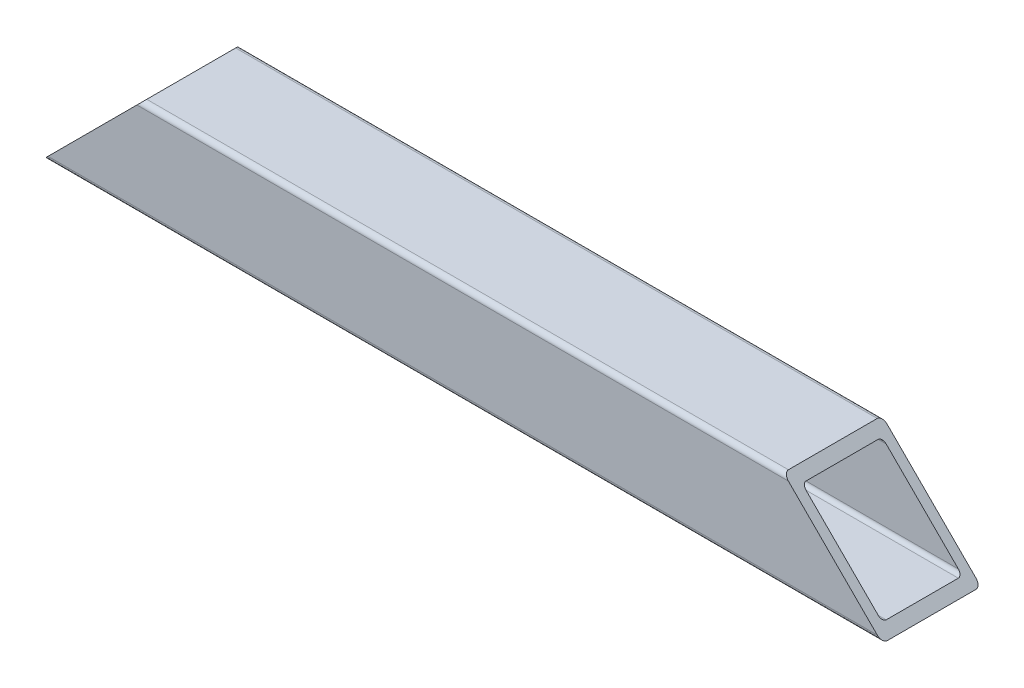
ISO-10303-21;
HEADER;
FILE_DESCRIPTION(('STEP AP214'),'2;1');
FILE_NAME('part.step','',(''),(''),'','','');
FILE_SCHEMA(('AUTOMOTIVE_DESIGN { 1 0 10303 214 1 1 1 1 }'));
ENDSEC;
DATA;
#1=APPLICATION_CONTEXT('core data for automotive mechanical design processes');
#2=APPLICATION_PROTOCOL_DEFINITION('international standard','automotive_design',2000,#1);
#3=PRODUCT_CONTEXT('',#1,'mechanical');
#4=PRODUCT('Part','Part','',(#3));
#5=PRODUCT_RELATED_PRODUCT_CATEGORY('part','',(#4));
#6=PRODUCT_DEFINITION_FORMATION('','',#4);
#7=PRODUCT_DEFINITION_CONTEXT('part definition',#1,'design');
#8=PRODUCT_DEFINITION('design','',#6,#7);
#9=PRODUCT_DEFINITION_SHAPE('','',#8);
#10=(LENGTH_UNIT() NAMED_UNIT(*) SI_UNIT(.MILLI.,.METRE.));
#11=(NAMED_UNIT(*) PLANE_ANGLE_UNIT() SI_UNIT($,.RADIAN.));
#12=(NAMED_UNIT(*) SI_UNIT($,.STERADIAN.) SOLID_ANGLE_UNIT());
#13=UNCERTAINTY_MEASURE_WITH_UNIT(LENGTH_MEASURE(1.E-05),#10,'distance_accuracy_value','');
#14=(GEOMETRIC_REPRESENTATION_CONTEXT(3) GLOBAL_UNCERTAINTY_ASSIGNED_CONTEXT((#13)) GLOBAL_UNIT_ASSIGNED_CONTEXT((#10,
#11,#12)) REPRESENTATION_CONTEXT('',''));
#15=CARTESIAN_POINT('',(0.,0.,0.));
#16=DIRECTION('',(0.,0.,1.));
#17=DIRECTION('',(1.,0.,0.));
#18=AXIS2_PLACEMENT_3D('',#15,#16,#17);
#19=CARTESIAN_POINT('',(-431.8,-25.4,-22.86));
#20=DIRECTION('',(0.,1.,0.));
#21=DIRECTION('',(0.,0.,1.));
#22=AXIS2_PLACEMENT_3D('',#19,#20,#21);
#23=PLANE('',#22);
#24=DIRECTION('',(0.,0.,1.));
#25=VECTOR('',#24,1.);
#26=CARTESIAN_POINT('',(0.,-25.4,-22.86));
#27=LINE('',#26,#25);
#28=CARTESIAN_POINT('',(0.,-25.4,-22.86));
#29=VERTEX_POINT('',#28);
#30=CARTESIAN_POINT('',(0.,-25.4,22.86));
#31=VERTEX_POINT('',#30);
#32=EDGE_CURVE('E328',#29,#31,#27,.T.);
#33=ORIENTED_EDGE('',*,*,#32,.T.);
#34=DIRECTION('',(1.,0.,0.));
#35=VECTOR('',#34,1.);
#36=CARTESIAN_POINT('',(-431.8,-25.4,22.86));
#37=LINE('',#36,#35);
#38=CARTESIAN_POINT('',(-431.8,-25.4,22.86));
#39=VERTEX_POINT('',#38);
#40=EDGE_CURVE('E123',#39,#31,#37,.T.);
#41=ORIENTED_EDGE('',*,*,#40,.F.);
#42=DIRECTION('',(0.,0.,1.));
#43=VECTOR('',#42,1.);
#44=CARTESIAN_POINT('',(-431.8,-25.4,-22.86));
#45=LINE('',#44,#43);
#46=CARTESIAN_POINT('',(-431.8,-25.4,-22.86));
#47=VERTEX_POINT('',#46);
#48=EDGE_CURVE('E289',#47,#39,#45,.T.);
#49=ORIENTED_EDGE('',*,*,#48,.F.);
#50=DIRECTION('',(1.,0.,0.));
#51=VECTOR('',#50,1.);
#52=CARTESIAN_POINT('',(-431.8,-25.4,-22.86));
#53=LINE('',#52,#51);
#54=EDGE_CURVE('E12',#47,#29,#53,.T.);
#55=ORIENTED_EDGE('',*,*,#54,.T.);
#56=EDGE_LOOP('',(#33,#41,#49,#55));
#57=FACE_BOUND('',#56,.T.);
#58=ADVANCED_FACE('F113',(#57),#23,.F.);
#59=CARTESIAN_POINT('',(-431.8,-22.86,-25.4));
#60=DIRECTION('',(0.,0.,1.));
#61=DIRECTION('',(0.,-1.,0.));
#62=AXIS2_PLACEMENT_3D('',#59,#60,#61);
#63=PLANE('',#62);
#64=DIRECTION('',(-0.707106781186551,0.707106781186544,0.));
#65=VECTOR('',#64,1.);
#66=CARTESIAN_POINT('',(-12.7,-12.7000000000001,-25.4));
#67=LINE('',#66,#65);
#68=CARTESIAN_POINT('',(-2.54000000000001,-22.86,-25.4));
#69=VERTEX_POINT('',#68);
#70=CARTESIAN_POINT('',(-48.2600000000005,22.86,-25.4));
#71=VERTEX_POINT('',#70);
#72=EDGE_CURVE('E240',#69,#71,#67,.T.);
#73=ORIENTED_EDGE('',*,*,#72,.F.);
#74=DIRECTION('',(1.,0.,0.));
#75=VECTOR('',#74,1.);
#76=CARTESIAN_POINT('',(-431.8,-22.86,-25.4));
#77=LINE('',#76,#75);
#78=CARTESIAN_POINT('',(-429.26,-22.86,-25.4));
#79=VERTEX_POINT('',#78);
#80=EDGE_CURVE('E270',#79,#69,#77,.T.);
#81=ORIENTED_EDGE('',*,*,#80,.F.);
#82=DIRECTION('',(0.707106781186551,0.707106781186544,0.));
#83=VECTOR('',#82,1.);
#84=CARTESIAN_POINT('',(-431.8,-25.4,-25.4));
#85=LINE('',#84,#83);
#86=CARTESIAN_POINT('',(-383.539999999999,22.8600000000001,-25.4));
#87=VERTEX_POINT('',#86);
#88=EDGE_CURVE('E405',#79,#87,#85,.T.);
#89=ORIENTED_EDGE('',*,*,#88,.T.);
#90=DIRECTION('',(1.,0.,0.));
#91=VECTOR('',#90,1.);
#92=CARTESIAN_POINT('',(-431.8,22.86,-25.4));
#93=LINE('',#92,#91);
#94=EDGE_CURVE('E264',#87,#71,#93,.T.);
#95=ORIENTED_EDGE('',*,*,#94,.T.);
#96=EDGE_LOOP('',(#73,#81,#89,#95));
#97=FACE_BOUND('',#96,.T.);
#98=ADVANCED_FACE('F436',(#97),#63,.F.);
#99=CARTESIAN_POINT('',(-431.8,22.86,-22.86));
#100=DIRECTION('',(1.,0.,0.));
#101=DIRECTION('',(0.,0.,-1.));
#102=AXIS2_PLACEMENT_3D('',#99,#100,#101);
#103=CYLINDRICAL_SURFACE('',#102,2.54);
#104=CARTESIAN_POINT('',(-48.2600000000005,22.86,-22.86));
#105=DIRECTION('',(0.707106781186544,0.707106781186551,0.));
#106=DIRECTION('',(0.707106781186551,-0.707106781186544,0.));
#107=AXIS2_PLACEMENT_3D('',#104,#105,#106);
#108=ELLIPSE('',#107,3.59210244842768,2.54);
#109=CARTESIAN_POINT('',(-50.8000000000005,25.4,-22.86));
#110=VERTEX_POINT('',#109);
#111=EDGE_CURVE('E234',#71,#110,#108,.T.);
#112=ORIENTED_EDGE('',*,*,#111,.F.);
#113=ORIENTED_EDGE('',*,*,#94,.F.);
#114=CARTESIAN_POINT('',(-383.539999999999,22.86,-22.86));
#115=DIRECTION('',(0.707106781186544,-0.707106781186551,0.));
#116=DIRECTION('',(0.707106781186551,0.707106781186544,0.));
#117=AXIS2_PLACEMENT_3D('',#114,#115,#116);
#118=ELLIPSE('',#117,3.59210244842768,2.54);
#119=CARTESIAN_POINT('',(-380.999999999999,25.4,-22.86));
#120=VERTEX_POINT('',#119);
#121=EDGE_CURVE('E262',#87,#120,#118,.T.);
#122=ORIENTED_EDGE('',*,*,#121,.T.);
#123=DIRECTION('',(1.,0.,0.));
#124=VECTOR('',#123,1.);
#125=CARTESIAN_POINT('',(-431.8,25.4,-22.86));
#126=LINE('',#125,#124);
#127=EDGE_CURVE('E253',#120,#110,#126,.T.);
#128=ORIENTED_EDGE('',*,*,#127,.T.);
#129=EDGE_LOOP('',(#112,#113,#122,#128));
#130=FACE_BOUND('',#129,.T.);
#131=ADVANCED_FACE('F261',(#130),#103,.T.);
#132=CARTESIAN_POINT('',(-431.8,25.4,-22.86));
#133=DIRECTION('',(0.,-1.,0.));
#134=DIRECTION('',(0.,0.,-1.));
#135=AXIS2_PLACEMENT_3D('',#132,#133,#134);
#136=PLANE('',#135);
#137=DIRECTION('',(0.,0.,1.));
#138=VECTOR('',#137,1.);
#139=CARTESIAN_POINT('',(-50.8000000000005,25.4,-25.4));
#140=LINE('',#139,#138);
#141=CARTESIAN_POINT('',(-50.8000000000005,25.4,22.86));
#142=VERTEX_POINT('',#141);
#143=EDGE_CURVE('E237',#110,#142,#140,.T.);
#144=ORIENTED_EDGE('',*,*,#143,.F.);
#145=ORIENTED_EDGE('',*,*,#127,.F.);
#146=DIRECTION('',(0.,0.,1.));
#147=VECTOR('',#146,1.);
#148=CARTESIAN_POINT('',(-380.999999999999,25.4,-25.4));
#149=LINE('',#148,#147);
#150=CARTESIAN_POINT('',(-380.999999999999,25.4,22.86));
#151=VERTEX_POINT('',#150);
#152=EDGE_CURVE('E409',#120,#151,#149,.T.);
#153=ORIENTED_EDGE('',*,*,#152,.T.);
#154=DIRECTION('',(1.,0.,0.));
#155=VECTOR('',#154,1.);
#156=CARTESIAN_POINT('',(-431.8,25.4,22.86));
#157=LINE('',#156,#155);
#158=EDGE_CURVE('E255',#151,#142,#157,.T.);
#159=ORIENTED_EDGE('',*,*,#158,.T.);
#160=EDGE_LOOP('',(#144,#145,#153,#159));
#161=FACE_BOUND('',#160,.T.);
#162=ADVANCED_FACE('F251',(#161),#136,.F.);
#163=CARTESIAN_POINT('',(-431.8,22.86,22.86));
#164=DIRECTION('',(1.,0.,0.));
#165=DIRECTION('',(0.,0.,-1.));
#166=AXIS2_PLACEMENT_3D('',#163,#164,#165);
#167=CYLINDRICAL_SURFACE('',#166,2.54);
#168=CARTESIAN_POINT('',(-48.2600000000005,22.86,22.86));
#169=DIRECTION('',(0.707106781186544,0.707106781186551,0.));
#170=DIRECTION('',(0.707106781186551,-0.707106781186544,0.));
#171=AXIS2_PLACEMENT_3D('',#168,#169,#170);
#172=ELLIPSE('',#171,3.59210244842768,2.54);
#173=CARTESIAN_POINT('',(-48.2600000000005,22.86,25.4));
#174=VERTEX_POINT('',#173);
#175=EDGE_CURVE('E246',#142,#174,#172,.T.);
#176=ORIENTED_EDGE('',*,*,#175,.F.);
#177=ORIENTED_EDGE('',*,*,#158,.F.);
#178=CARTESIAN_POINT('',(-383.539999999999,22.86,22.86));
#179=DIRECTION('',(0.707106781186544,-0.707106781186551,0.));
#180=DIRECTION('',(0.707106781186551,0.707106781186544,0.));
#181=AXIS2_PLACEMENT_3D('',#178,#179,#180);
#182=ELLIPSE('',#181,3.59210244842768,2.54);
#183=CARTESIAN_POINT('',(-383.539999999999,22.86,25.4));
#184=VERTEX_POINT('',#183);
#185=EDGE_CURVE('E341',#151,#184,#182,.T.);
#186=ORIENTED_EDGE('',*,*,#185,.T.);
#187=DIRECTION('',(1.,0.,0.));
#188=VECTOR('',#187,1.);
#189=CARTESIAN_POINT('',(-431.8,22.86,25.4));
#190=LINE('',#189,#188);
#191=EDGE_CURVE('E268',#184,#174,#190,.T.);
#192=ORIENTED_EDGE('',*,*,#191,.T.);
#193=EDGE_LOOP('',(#176,#177,#186,#192));
#194=FACE_BOUND('',#193,.T.);
#195=ADVANCED_FACE('F425',(#194),#167,.T.);
#196=CARTESIAN_POINT('',(-431.8,-22.86,25.4));
#197=DIRECTION('',(0.,0.,-1.));
#198=DIRECTION('',(0.,1.,0.));
#199=AXIS2_PLACEMENT_3D('',#196,#197,#198);
#200=PLANE('',#199);
#201=DIRECTION('',(-0.707106781186551,0.707106781186544,0.));
#202=VECTOR('',#201,1.);
#203=CARTESIAN_POINT('',(-12.7,-12.7000000000001,25.4));
#204=LINE('',#203,#202);
#205=CARTESIAN_POINT('',(-2.54000000000001,-22.86,25.4));
#206=VERTEX_POINT('',#205);
#207=EDGE_CURVE('E257',#206,#174,#204,.T.);
#208=ORIENTED_EDGE('',*,*,#207,.T.);
#209=ORIENTED_EDGE('',*,*,#191,.F.);
#210=DIRECTION('',(0.707106781186551,0.707106781186544,0.));
#211=VECTOR('',#210,1.);
#212=CARTESIAN_POINT('',(-431.8,-25.4,25.4));
#213=LINE('',#212,#211);
#214=CARTESIAN_POINT('',(-429.26,-22.86,25.4));
#215=VERTEX_POINT('',#214);
#216=EDGE_CURVE('E258',#215,#184,#213,.T.);
#217=ORIENTED_EDGE('',*,*,#216,.F.);
#218=DIRECTION('',(1.,0.,0.));
#219=VECTOR('',#218,1.);
#220=CARTESIAN_POINT('',(-431.8,-22.86,25.4));
#221=LINE('',#220,#219);
#222=EDGE_CURVE('E277',#215,#206,#221,.T.);
#223=ORIENTED_EDGE('',*,*,#222,.T.);
#224=EDGE_LOOP('',(#208,#209,#217,#223));
#225=FACE_BOUND('',#224,.T.);
#226=ADVANCED_FACE('F420',(#225),#200,.F.);
#227=CARTESIAN_POINT('',(-431.8,-22.86,22.86));
#228=DIRECTION('',(1.,0.,0.));
#229=DIRECTION('',(0.,0.,-1.));
#230=AXIS2_PLACEMENT_3D('',#227,#228,#229);
#231=CYLINDRICAL_SURFACE('',#230,2.54);
#232=CARTESIAN_POINT('',(-2.53999999999999,-22.86,22.86));
#233=DIRECTION('',(0.707106781186544,0.707106781186551,0.));
#234=DIRECTION('',(0.707106781186551,-0.707106781186544,0.));
#235=AXIS2_PLACEMENT_3D('',#232,#233,#234);
#236=ELLIPSE('',#235,3.59210244842768,2.54);
#237=EDGE_CURVE('E373',#206,#31,#236,.T.);
#238=ORIENTED_EDGE('',*,*,#237,.F.);
#239=ORIENTED_EDGE('',*,*,#222,.F.);
#240=CARTESIAN_POINT('',(-429.26,-22.86,22.86));
#241=DIRECTION('',(0.707106781186544,-0.707106781186551,0.));
#242=DIRECTION('',(0.707106781186551,0.707106781186544,0.));
#243=AXIS2_PLACEMENT_3D('',#240,#241,#242);
#244=ELLIPSE('',#243,3.59210244842768,2.54);
#245=EDGE_CURVE('E337',#215,#39,#244,.T.);
#246=ORIENTED_EDGE('',*,*,#245,.T.);
#247=ORIENTED_EDGE('',*,*,#40,.T.);
#248=EDGE_LOOP('',(#238,#239,#246,#247));
#249=FACE_BOUND('',#248,.T.);
#250=ADVANCED_FACE('F429',(#249),#231,.T.);
#251=CARTESIAN_POINT('',(-431.8,-22.86,-22.86));
#252=DIRECTION('',(1.,0.,0.));
#253=DIRECTION('',(0.,0.,-1.));
#254=AXIS2_PLACEMENT_3D('',#251,#252,#253);
#255=CYLINDRICAL_SURFACE('',#254,2.54);
#256=CARTESIAN_POINT('',(-2.53999999999999,-22.86,-22.86));
#257=DIRECTION('',(0.707106781186544,0.707106781186551,0.));
#258=DIRECTION('',(0.707106781186551,-0.707106781186544,0.));
#259=AXIS2_PLACEMENT_3D('',#256,#257,#258);
#260=ELLIPSE('',#259,3.59210244842768,2.54);
#261=EDGE_CURVE('E370',#29,#69,#260,.T.);
#262=ORIENTED_EDGE('',*,*,#261,.F.);
#263=ORIENTED_EDGE('',*,*,#54,.F.);
#264=CARTESIAN_POINT('',(-429.26,-22.86,-22.86));
#265=DIRECTION('',(0.707106781186544,-0.707106781186551,0.));
#266=DIRECTION('',(0.707106781186551,0.707106781186544,0.));
#267=AXIS2_PLACEMENT_3D('',#264,#265,#266);
#268=ELLIPSE('',#267,3.59210244842768,2.54);
#269=EDGE_CURVE('E332',#47,#79,#268,.T.);
#270=ORIENTED_EDGE('',*,*,#269,.T.);
#271=ORIENTED_EDGE('',*,*,#80,.T.);
#272=EDGE_LOOP('',(#262,#263,#270,#271));
#273=FACE_BOUND('',#272,.T.);
#274=ADVANCED_FACE('F434',(#273),#255,.T.);
#275=CARTESIAN_POINT('',(-12.7,-12.7000000000001,-25.4));
#276=DIRECTION('',(0.707106781186544,0.707106781186551,0.));
#277=DIRECTION('',(-0.707106781186551,0.707106781186544,0.));
#278=AXIS2_PLACEMENT_3D('',#275,#276,#277);
#279=PLANE('',#278);
#280=DIRECTION('',(-0.707106781186551,0.707106781186544,0.));
#281=VECTOR('',#280,1.);
#282=CARTESIAN_POINT('',(-219.318840000002,193.91884,-20.6248));
#283=LINE('',#282,#281);
#284=CARTESIAN_POINT('',(-6.8376800000001,-18.56232,-20.6248));
#285=VERTEX_POINT('',#284);
#286=CARTESIAN_POINT('',(-43.9623200000005,18.56232,-20.6248));
#287=VERTEX_POINT('',#286);
#288=EDGE_CURVE('E402',#285,#287,#283,.T.);
#289=ORIENTED_EDGE('',*,*,#288,.F.);
#290=CARTESIAN_POINT('',(-6.83768000000007,-18.56232,-18.56232));
#291=DIRECTION('',(0.707106781186544,0.707106781186551,0.));
#292=DIRECTION('',(0.707106781186551,-0.707106781186544,0.));
#293=AXIS2_PLACEMENT_3D('',#290,#291,#292);
#294=ELLIPSE('',#293,2.91678718812328,2.06248);
#295=CARTESIAN_POINT('',(-4.77520000000004,-20.6248,-18.56232));
#296=VERTEX_POINT('',#295);
#297=EDGE_CURVE('E398',#296,#285,#294,.T.);
#298=ORIENTED_EDGE('',*,*,#297,.F.);
#299=DIRECTION('',(0.,0.,-1.));
#300=VECTOR('',#299,1.);
#301=CARTESIAN_POINT('',(-4.77520000000004,-20.6248,18.56232));
#302=LINE('',#301,#300);
#303=CARTESIAN_POINT('',(-4.77520000000004,-20.6248,18.56232));
#304=VERTEX_POINT('',#303);
#305=EDGE_CURVE('E394',#304,#296,#302,.T.);
#306=ORIENTED_EDGE('',*,*,#305,.F.);
#307=CARTESIAN_POINT('',(-6.83768000000007,-18.56232,18.56232));
#308=DIRECTION('',(0.707106781186544,0.707106781186551,0.));
#309=DIRECTION('',(0.707106781186551,-0.707106781186544,0.));
#310=AXIS2_PLACEMENT_3D('',#307,#308,#309);
#311=ELLIPSE('',#310,2.91678718812328,2.06248);
#312=CARTESIAN_POINT('',(-6.83768000000007,-18.56232,20.6248));
#313=VERTEX_POINT('',#312);
#314=EDGE_CURVE('E390',#313,#304,#311,.T.);
#315=ORIENTED_EDGE('',*,*,#314,.F.);
#316=DIRECTION('',(0.707106781186551,-0.707106781186544,0.));
#317=VECTOR('',#316,1.);
#318=CARTESIAN_POINT('',(-219.318840000002,193.91884,20.6248));
#319=LINE('',#318,#317);
#320=CARTESIAN_POINT('',(-43.9623200000004,18.56232,20.6248));
#321=VERTEX_POINT('',#320);
#322=EDGE_CURVE('E386',#321,#313,#319,.T.);
#323=ORIENTED_EDGE('',*,*,#322,.F.);
#324=CARTESIAN_POINT('',(-43.9623200000004,18.56232,18.56232));
#325=DIRECTION('',(0.707106781186544,0.707106781186551,0.));
#326=DIRECTION('',(0.707106781186551,-0.707106781186544,0.));
#327=AXIS2_PLACEMENT_3D('',#324,#325,#326);
#328=ELLIPSE('',#327,2.91678718812328,2.06248);
#329=CARTESIAN_POINT('',(-46.0248000000004,20.6248,18.56232));
#330=VERTEX_POINT('',#329);
#331=EDGE_CURVE('E383',#330,#321,#328,.T.);
#332=ORIENTED_EDGE('',*,*,#331,.F.);
#333=DIRECTION('',(0.,0.,1.));
#334=VECTOR('',#333,1.);
#335=CARTESIAN_POINT('',(-46.0248000000004,20.6248,18.5623200000001));
#336=LINE('',#335,#334);
#337=CARTESIAN_POINT('',(-46.0248000000004,20.6248,-18.56232));
#338=VERTEX_POINT('',#337);
#339=EDGE_CURVE('E380',#338,#330,#336,.T.);
#340=ORIENTED_EDGE('',*,*,#339,.F.);
#341=CARTESIAN_POINT('',(-43.9623200000004,18.56232,-18.56232));
#342=DIRECTION('',(0.707106781186544,0.707106781186551,0.));
#343=DIRECTION('',(0.707106781186551,-0.707106781186544,0.));
#344=AXIS2_PLACEMENT_3D('',#341,#342,#343);
#345=ELLIPSE('',#344,2.91678718812328,2.06248);
#346=EDGE_CURVE('E142',#287,#338,#345,.T.);
#347=ORIENTED_EDGE('',*,*,#346,.F.);
#348=EDGE_LOOP('',(#289,#298,#306,#315,#323,#332,#340,#347));
#349=FACE_BOUND('',#348,.T.);
#350=ORIENTED_EDGE('',*,*,#261,.T.);
#351=ORIENTED_EDGE('',*,*,#72,.T.);
#352=ORIENTED_EDGE('',*,*,#111,.T.);
#353=ORIENTED_EDGE('',*,*,#143,.T.);
#354=ORIENTED_EDGE('',*,*,#175,.T.);
#355=ORIENTED_EDGE('',*,*,#207,.F.);
#356=ORIENTED_EDGE('',*,*,#237,.T.);
#357=ORIENTED_EDGE('',*,*,#32,.F.);
#358=EDGE_LOOP('',(#350,#351,#352,#353,#354,#355,#356,#357));
#359=FACE_BOUND('',#358,.T.);
#360=ADVANCED_FACE('F236',(#349,#359),#279,.T.);
#361=CARTESIAN_POINT('',(-203.199999999998,203.2,-25.4));
#362=DIRECTION('',(0.707106781186544,-0.707106781186551,0.));
#363=DIRECTION('',(0.707106781186551,0.707106781186544,0.));
#364=AXIS2_PLACEMENT_3D('',#361,#362,#363);
#365=PLANE('',#364);
#366=CARTESIAN_POINT('',(-387.837679999999,18.56232,-18.56232));
#367=DIRECTION('',(0.707106781186544,-0.707106781186551,0.));
#368=DIRECTION('',(0.707106781186551,0.707106781186544,0.));
#369=AXIS2_PLACEMENT_3D('',#366,#367,#368);
#370=ELLIPSE('',#369,2.91678718812328,2.06248);
#371=CARTESIAN_POINT('',(-387.837679999999,18.56232,-20.6248));
#372=VERTEX_POINT('',#371);
#373=CARTESIAN_POINT('',(-385.775199999999,20.6248,-18.56232));
#374=VERTEX_POINT('',#373);
#375=EDGE_CURVE('E347',#372,#374,#370,.T.);
#376=ORIENTED_EDGE('',*,*,#375,.T.);
#377=DIRECTION('',(0.,0.,1.));
#378=VECTOR('',#377,1.);
#379=CARTESIAN_POINT('',(-385.775199999999,20.6248,18.56232));
#380=LINE('',#379,#378);
#381=CARTESIAN_POINT('',(-385.775199999999,20.6248,18.56232));
#382=VERTEX_POINT('',#381);
#383=EDGE_CURVE('E350',#374,#382,#380,.T.);
#384=ORIENTED_EDGE('',*,*,#383,.T.);
#385=CARTESIAN_POINT('',(-387.837679999999,18.56232,18.56232));
#386=DIRECTION('',(0.707106781186544,-0.707106781186551,0.));
#387=DIRECTION('',(0.707106781186551,0.707106781186544,0.));
#388=AXIS2_PLACEMENT_3D('',#385,#386,#387);
#389=ELLIPSE('',#388,2.91678718812328,2.06248);
#390=CARTESIAN_POINT('',(-387.837679999999,18.56232,20.6248));
#391=VERTEX_POINT('',#390);
#392=EDGE_CURVE('E353',#382,#391,#389,.T.);
#393=ORIENTED_EDGE('',*,*,#392,.T.);
#394=DIRECTION('',(-0.707106781186551,-0.707106781186544,0.));
#395=VECTOR('',#394,1.);
#396=CARTESIAN_POINT('',(-428.38116,-21.98116,20.6248));
#397=LINE('',#396,#395);
#398=CARTESIAN_POINT('',(-424.96232,-18.56232,20.6248));
#399=VERTEX_POINT('',#398);
#400=EDGE_CURVE('E356',#391,#399,#397,.T.);
#401=ORIENTED_EDGE('',*,*,#400,.T.);
#402=CARTESIAN_POINT('',(-424.96232,-18.56232,18.56232));
#403=DIRECTION('',(0.707106781186544,-0.707106781186551,0.));
#404=DIRECTION('',(0.707106781186551,0.707106781186544,0.));
#405=AXIS2_PLACEMENT_3D('',#402,#403,#404);
#406=ELLIPSE('',#405,2.91678718812328,2.06248);
#407=CARTESIAN_POINT('',(-427.0248,-20.6248,18.56232));
#408=VERTEX_POINT('',#407);
#409=EDGE_CURVE('E359',#399,#408,#406,.T.);
#410=ORIENTED_EDGE('',*,*,#409,.T.);
#411=DIRECTION('',(0.,0.,-1.));
#412=VECTOR('',#411,1.);
#413=CARTESIAN_POINT('',(-427.0248,-20.6248,18.56232));
#414=LINE('',#413,#412);
#415=CARTESIAN_POINT('',(-427.0248,-20.6248,-18.56232));
#416=VERTEX_POINT('',#415);
#417=EDGE_CURVE('E362',#408,#416,#414,.T.);
#418=ORIENTED_EDGE('',*,*,#417,.T.);
#419=CARTESIAN_POINT('',(-424.96232,-18.56232,-18.56232));
#420=DIRECTION('',(0.707106781186544,-0.707106781186551,0.));
#421=DIRECTION('',(0.707106781186551,0.707106781186544,0.));
#422=AXIS2_PLACEMENT_3D('',#419,#420,#421);
#423=ELLIPSE('',#422,2.91678718812328,2.06248);
#424=CARTESIAN_POINT('',(-424.96232,-18.56232,-20.6248));
#425=VERTEX_POINT('',#424);
#426=EDGE_CURVE('E131',#416,#425,#423,.T.);
#427=ORIENTED_EDGE('',*,*,#426,.T.);
#428=DIRECTION('',(0.707106781186551,0.707106781186544,0.));
#429=VECTOR('',#428,1.);
#430=CARTESIAN_POINT('',(-428.38116,-21.98116,-20.6248));
#431=LINE('',#430,#429);
#432=EDGE_CURVE('E367',#425,#372,#431,.T.);
#433=ORIENTED_EDGE('',*,*,#432,.T.);
#434=EDGE_LOOP('',(#376,#384,#393,#401,#410,#418,#427,#433));
#435=FACE_BOUND('',#434,.T.);
#436=ORIENTED_EDGE('',*,*,#48,.T.);
#437=ORIENTED_EDGE('',*,*,#245,.F.);
#438=ORIENTED_EDGE('',*,*,#216,.T.);
#439=ORIENTED_EDGE('',*,*,#185,.F.);
#440=ORIENTED_EDGE('',*,*,#152,.F.);
#441=ORIENTED_EDGE('',*,*,#121,.F.);
#442=ORIENTED_EDGE('',*,*,#88,.F.);
#443=ORIENTED_EDGE('',*,*,#269,.F.);
#444=EDGE_LOOP('',(#436,#437,#438,#439,#440,#441,#442,#443));
#445=FACE_BOUND('',#444,.T.);
#446=ADVANCED_FACE('F427',(#435,#445),#365,.F.);
#447=CARTESIAN_POINT('',(-431.8,18.56232,-18.56232));
#448=DIRECTION('',(1.,0.,0.));
#449=DIRECTION('',(0.,0.,-1.));
#450=AXIS2_PLACEMENT_3D('',#447,#448,#449);
#451=CYLINDRICAL_SURFACE('',#450,2.06248);
#452=DIRECTION('',(1.,0.,0.));
#453=VECTOR('',#452,1.);
#454=CARTESIAN_POINT('',(-431.8,18.56232,-20.6248));
#455=LINE('',#454,#453);
#456=EDGE_CURVE('E284',#372,#287,#455,.T.);
#457=ORIENTED_EDGE('',*,*,#456,.T.);
#458=ORIENTED_EDGE('',*,*,#346,.T.);
#459=DIRECTION('',(1.,0.,0.));
#460=VECTOR('',#459,1.);
#461=CARTESIAN_POINT('',(-431.8,20.6248,-18.56232));
#462=LINE('',#461,#460);
#463=EDGE_CURVE('E117',#374,#338,#462,.T.);
#464=ORIENTED_EDGE('',*,*,#463,.F.);
#465=ORIENTED_EDGE('',*,*,#375,.F.);
#466=EDGE_LOOP('',(#457,#458,#464,#465));
#467=FACE_BOUND('',#466,.T.);
#468=ADVANCED_FACE('F115',(#467),#451,.F.);
#469=CARTESIAN_POINT('',(-431.8,20.6248,18.56232));
#470=DIRECTION('',(0.,-1.,0.));
#471=DIRECTION('',(0.,0.,-1.));
#472=AXIS2_PLACEMENT_3D('',#469,#470,#471);
#473=PLANE('',#472);
#474=ORIENTED_EDGE('',*,*,#463,.T.);
#475=ORIENTED_EDGE('',*,*,#339,.T.);
#476=DIRECTION('',(1.,0.,0.));
#477=VECTOR('',#476,1.);
#478=CARTESIAN_POINT('',(-431.8,20.6248,18.56232));
#479=LINE('',#478,#477);
#480=EDGE_CURVE('E308',#382,#330,#479,.T.);
#481=ORIENTED_EDGE('',*,*,#480,.F.);
#482=ORIENTED_EDGE('',*,*,#383,.F.);
#483=EDGE_LOOP('',(#474,#475,#481,#482));
#484=FACE_BOUND('',#483,.T.);
#485=ADVANCED_FACE('F480',(#484),#473,.T.);
#486=CARTESIAN_POINT('',(-431.8,18.56232,18.56232));
#487=DIRECTION('',(1.,0.,0.));
#488=DIRECTION('',(0.,0.,-1.));
#489=AXIS2_PLACEMENT_3D('',#486,#487,#488);
#490=CYLINDRICAL_SURFACE('',#489,2.06248);
#491=ORIENTED_EDGE('',*,*,#480,.T.);
#492=ORIENTED_EDGE('',*,*,#331,.T.);
#493=DIRECTION('',(1.,0.,0.));
#494=VECTOR('',#493,1.);
#495=CARTESIAN_POINT('',(-431.8,18.56232,20.6248));
#496=LINE('',#495,#494);
#497=EDGE_CURVE('E305',#391,#321,#496,.T.);
#498=ORIENTED_EDGE('',*,*,#497,.F.);
#499=ORIENTED_EDGE('',*,*,#392,.F.);
#500=EDGE_LOOP('',(#491,#492,#498,#499));
#501=FACE_BOUND('',#500,.T.);
#502=ADVANCED_FACE('F477',(#501),#490,.F.);
#503=CARTESIAN_POINT('',(-431.8,-18.56232,20.6248));
#504=DIRECTION('',(0.,0.,-1.));
#505=DIRECTION('',(0.,1.,0.));
#506=AXIS2_PLACEMENT_3D('',#503,#504,#505);
#507=PLANE('',#506);
#508=ORIENTED_EDGE('',*,*,#497,.T.);
#509=ORIENTED_EDGE('',*,*,#322,.T.);
#510=DIRECTION('',(1.,0.,0.));
#511=VECTOR('',#510,1.);
#512=CARTESIAN_POINT('',(-431.8,-18.56232,20.6248));
#513=LINE('',#512,#511);
#514=EDGE_CURVE('E301',#399,#313,#513,.T.);
#515=ORIENTED_EDGE('',*,*,#514,.F.);
#516=ORIENTED_EDGE('',*,*,#400,.F.);
#517=EDGE_LOOP('',(#508,#509,#515,#516));
#518=FACE_BOUND('',#517,.T.);
#519=ADVANCED_FACE('F473',(#518),#507,.T.);
#520=CARTESIAN_POINT('',(-431.8,-18.56232,18.56232));
#521=DIRECTION('',(1.,0.,0.));
#522=DIRECTION('',(0.,0.,-1.));
#523=AXIS2_PLACEMENT_3D('',#520,#521,#522);
#524=CYLINDRICAL_SURFACE('',#523,2.06248);
#525=ORIENTED_EDGE('',*,*,#514,.T.);
#526=ORIENTED_EDGE('',*,*,#314,.T.);
#527=DIRECTION('',(1.,0.,0.));
#528=VECTOR('',#527,1.);
#529=CARTESIAN_POINT('',(-431.8,-20.6248,18.56232));
#530=LINE('',#529,#528);
#531=EDGE_CURVE('E297',#408,#304,#530,.T.);
#532=ORIENTED_EDGE('',*,*,#531,.F.);
#533=ORIENTED_EDGE('',*,*,#409,.F.);
#534=EDGE_LOOP('',(#525,#526,#532,#533));
#535=FACE_BOUND('',#534,.T.);
#536=ADVANCED_FACE('F469',(#535),#524,.F.);
#537=CARTESIAN_POINT('',(-431.8,-20.6248,18.56232));
#538=DIRECTION('',(0.,1.,0.));
#539=DIRECTION('',(0.,0.,1.));
#540=AXIS2_PLACEMENT_3D('',#537,#538,#539);
#541=PLANE('',#540);
#542=ORIENTED_EDGE('',*,*,#531,.T.);
#543=ORIENTED_EDGE('',*,*,#305,.T.);
#544=DIRECTION('',(1.,0.,0.));
#545=VECTOR('',#544,1.);
#546=CARTESIAN_POINT('',(-431.8,-20.6248,-18.56232));
#547=LINE('',#546,#545);
#548=EDGE_CURVE('E293',#416,#296,#547,.T.);
#549=ORIENTED_EDGE('',*,*,#548,.F.);
#550=ORIENTED_EDGE('',*,*,#417,.F.);
#551=EDGE_LOOP('',(#542,#543,#549,#550));
#552=FACE_BOUND('',#551,.T.);
#553=ADVANCED_FACE('F465',(#552),#541,.T.);
#554=CARTESIAN_POINT('',(-431.8,-18.56232,-18.56232));
#555=DIRECTION('',(1.,0.,0.));
#556=DIRECTION('',(0.,0.,-1.));
#557=AXIS2_PLACEMENT_3D('',#554,#555,#556);
#558=CYLINDRICAL_SURFACE('',#557,2.06248);
#559=ORIENTED_EDGE('',*,*,#548,.T.);
#560=ORIENTED_EDGE('',*,*,#297,.T.);
#561=DIRECTION('',(1.,0.,0.));
#562=VECTOR('',#561,1.);
#563=CARTESIAN_POINT('',(-431.8,-18.56232,-20.6248));
#564=LINE('',#563,#562);
#565=EDGE_CURVE('E288',#425,#285,#564,.T.);
#566=ORIENTED_EDGE('',*,*,#565,.F.);
#567=ORIENTED_EDGE('',*,*,#426,.F.);
#568=EDGE_LOOP('',(#559,#560,#566,#567));
#569=FACE_BOUND('',#568,.T.);
#570=ADVANCED_FACE('F461',(#569),#558,.F.);
#571=CARTESIAN_POINT('',(-431.8,-18.56232,-20.6248));
#572=DIRECTION('',(0.,0.,1.));
#573=DIRECTION('',(0.,-1.,0.));
#574=AXIS2_PLACEMENT_3D('',#571,#572,#573);
#575=PLANE('',#574);
#576=ORIENTED_EDGE('',*,*,#565,.T.);
#577=ORIENTED_EDGE('',*,*,#288,.T.);
#578=ORIENTED_EDGE('',*,*,#456,.F.);
#579=ORIENTED_EDGE('',*,*,#432,.F.);
#580=EDGE_LOOP('',(#576,#577,#578,#579));
#581=FACE_BOUND('',#580,.T.);
#582=ADVANCED_FACE('F458',(#581),#575,.T.);
#583=CLOSED_SHELL('',(#58,#98,#131,#162,#195,#226,#250,#274,#360,#446,#468,#485,#502,#519,#536,
#553,#570,#582));
#584=MANIFOLD_SOLID_BREP('B2',#583);
#585=ADVANCED_BREP_SHAPE_REPRESENTATION('',(#18,#584),#14);
#586=SHAPE_DEFINITION_REPRESENTATION(#9,#585);
ENDSEC;
END-ISO-10303-21;
